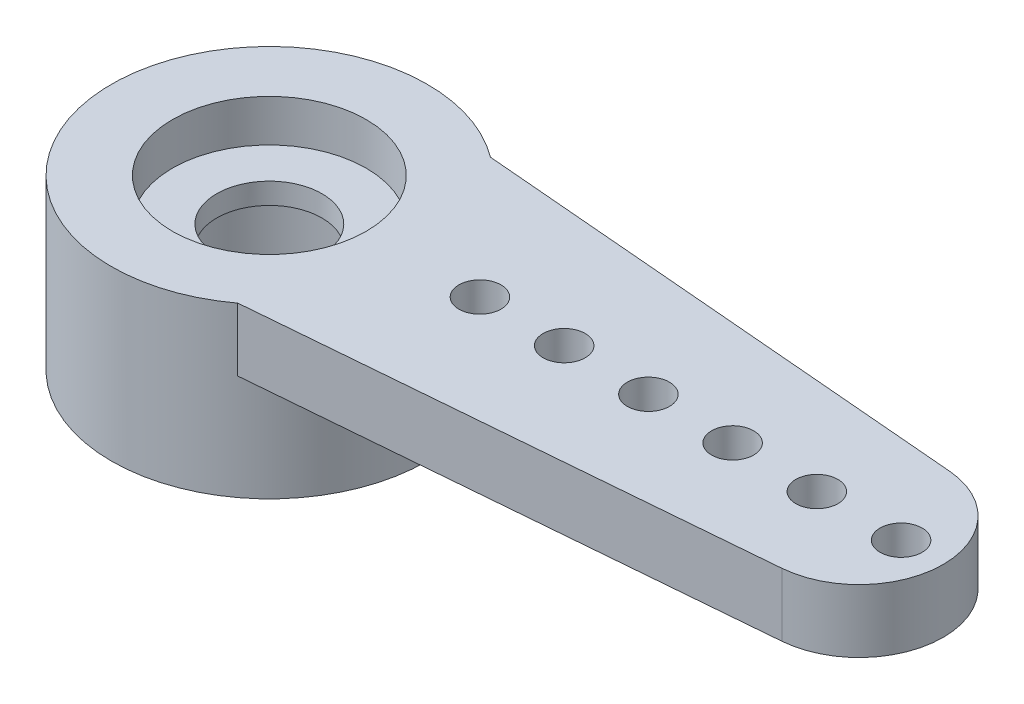
ISO-10303-21;
HEADER;
FILE_DESCRIPTION(('STEP AP214'),'2;1');
FILE_NAME('part.step','',(''),(''),'','','');
FILE_SCHEMA(('AUTOMOTIVE_DESIGN { 1 0 10303 214 1 1 1 1 }'));
ENDSEC;
DATA;
#1=APPLICATION_CONTEXT('core data for automotive mechanical design processes');
#2=APPLICATION_PROTOCOL_DEFINITION('international standard','automotive_design',2000,#1);
#3=PRODUCT_CONTEXT('',#1,'mechanical');
#4=PRODUCT('Part','Part','',(#3));
#5=PRODUCT_RELATED_PRODUCT_CATEGORY('part','',(#4));
#6=PRODUCT_DEFINITION_FORMATION('','',#4);
#7=PRODUCT_DEFINITION_CONTEXT('part definition',#1,'design');
#8=PRODUCT_DEFINITION('design','',#6,#7);
#9=PRODUCT_DEFINITION_SHAPE('','',#8);
#10=(LENGTH_UNIT() NAMED_UNIT(*) SI_UNIT(.MILLI.,.METRE.));
#11=(NAMED_UNIT(*) PLANE_ANGLE_UNIT() SI_UNIT($,.RADIAN.));
#12=(NAMED_UNIT(*) SI_UNIT($,.STERADIAN.) SOLID_ANGLE_UNIT());
#13=UNCERTAINTY_MEASURE_WITH_UNIT(LENGTH_MEASURE(1.E-05),#10,'distance_accuracy_value','');
#14=(GEOMETRIC_REPRESENTATION_CONTEXT(3) GLOBAL_UNCERTAINTY_ASSIGNED_CONTEXT((#13)) GLOBAL_UNIT_ASSIGNED_CONTEXT((#10,
#11,#12)) REPRESENTATION_CONTEXT('',''));
#15=CARTESIAN_POINT('',(0.,0.,0.));
#16=DIRECTION('',(0.,0.,1.));
#17=DIRECTION('',(1.,0.,0.));
#18=AXIS2_PLACEMENT_3D('',#15,#16,#17);
#19=CARTESIAN_POINT('',(0.,-1.5,0.));
#20=DIRECTION('',(0.,1.,0.));
#21=DIRECTION('',(0.,0.,1.));
#22=AXIS2_PLACEMENT_3D('',#19,#20,#21);
#23=CYLINDRICAL_SURFACE('',#22,1.25);
#24=CARTESIAN_POINT('',(0.,3.,0.));
#25=DIRECTION('',(0.,1.,0.));
#26=DIRECTION('',(0.,0.,1.));
#27=AXIS2_PLACEMENT_3D('',#24,#25,#26);
#28=CIRCLE('',#27,1.25);
#29=CARTESIAN_POINT('',(0.,3.,1.25));
#30=VERTEX_POINT('',#29);
#31=EDGE_CURVE('E217',#30,#30,#28,.T.);
#32=ORIENTED_EDGE('',*,*,#31,.T.);
#33=EDGE_LOOP('',(#32));
#34=FACE_BOUND('',#33,.T.);
#35=CARTESIAN_POINT('',(0.,2.5,0.));
#36=DIRECTION('',(0.,-1.,0.));
#37=DIRECTION('',(0.,0.,-1.));
#38=AXIS2_PLACEMENT_3D('',#35,#36,#37);
#39=CIRCLE('',#38,1.25);
#40=CARTESIAN_POINT('',(0.,2.5,-1.25));
#41=VERTEX_POINT('',#40);
#42=EDGE_CURVE('E51',#41,#41,#39,.F.);
#43=ORIENTED_EDGE('',*,*,#42,.F.);
#44=EDGE_LOOP('',(#43));
#45=FACE_BOUND('',#44,.T.);
#46=ADVANCED_FACE('F50',(#34,#45),#23,.F.);
#47=CARTESIAN_POINT('',(0.,4.,0.));
#48=DIRECTION('',(0.,-1.,0.));
#49=DIRECTION('',(0.,0.,-1.));
#50=AXIS2_PLACEMENT_3D('',#47,#48,#49);
#51=CYLINDRICAL_SURFACE('',#50,3.75);
#52=CARTESIAN_POINT('',(0.,4.,0.));
#53=DIRECTION('',(0.,1.,0.));
#54=DIRECTION('',(0.,0.,1.));
#55=AXIS2_PLACEMENT_3D('',#52,#53,#54);
#56=CIRCLE('',#55,3.75);
#57=CARTESIAN_POINT('',(2.25,4.,-3.));
#58=VERTEX_POINT('',#57);
#59=CARTESIAN_POINT('',(2.25,4.,3.));
#60=VERTEX_POINT('',#59);
#61=EDGE_CURVE('E11',#58,#60,#56,.T.);
#62=ORIENTED_EDGE('',*,*,#61,.F.);
#63=DIRECTION('',(0.,1.,0.));
#64=VECTOR('',#63,1.);
#65=CARTESIAN_POINT('',(2.25,2.5,-3.));
#66=LINE('',#65,#64);
#67=CARTESIAN_POINT('',(2.25,2.5,-3.));
#68=VERTEX_POINT('',#67);
#69=EDGE_CURVE('E129',#68,#58,#66,.T.);
#70=ORIENTED_EDGE('',*,*,#69,.F.);
#71=CARTESIAN_POINT('',(0.,2.5,0.));
#72=DIRECTION('',(0.,-1.,0.));
#73=DIRECTION('',(0.,0.,-1.));
#74=AXIS2_PLACEMENT_3D('',#71,#72,#73);
#75=CIRCLE('',#74,3.75);
#76=CARTESIAN_POINT('',(2.25,2.5,3.));
#77=VERTEX_POINT('',#76);
#78=EDGE_CURVE('E71',#68,#77,#75,.T.);
#79=ORIENTED_EDGE('',*,*,#78,.T.);
#80=DIRECTION('',(0.,1.,0.));
#81=VECTOR('',#80,1.);
#82=CARTESIAN_POINT('',(2.25,2.5,3.));
#83=LINE('',#82,#81);
#84=EDGE_CURVE('E100',#77,#60,#83,.T.);
#85=ORIENTED_EDGE('',*,*,#84,.T.);
#86=EDGE_LOOP('',(#62,#70,#79,#85));
#87=FACE_BOUND('',#86,.T.);
#88=CARTESIAN_POINT('',(0.,0.,0.));
#89=DIRECTION('',(0.,1.,0.));
#90=DIRECTION('',(0.,0.,1.));
#91=AXIS2_PLACEMENT_3D('',#88,#89,#90);
#92=CIRCLE('',#91,3.75);
#93=CARTESIAN_POINT('',(0.,0.,3.75));
#94=VERTEX_POINT('',#93);
#95=EDGE_CURVE('E60',#94,#94,#92,.T.);
#96=ORIENTED_EDGE('',*,*,#95,.T.);
#97=EDGE_LOOP('',(#96));
#98=FACE_BOUND('',#97,.T.);
#99=ADVANCED_FACE('F47',(#87,#98),#51,.T.);
#100=CARTESIAN_POINT('',(0.,4.,0.));
#101=DIRECTION('',(0.,1.,0.));
#102=DIRECTION('',(0.,0.,1.));
#103=AXIS2_PLACEMENT_3D('',#100,#101,#102);
#104=PLANE('',#103);
#105=CARTESIAN_POINT('',(0.,4.,0.));
#106=DIRECTION('',(0.,1.,0.));
#107=DIRECTION('',(0.,0.,1.));
#108=AXIS2_PLACEMENT_3D('',#105,#106,#107);
#109=CIRCLE('',#108,2.3);
#110=CARTESIAN_POINT('',(0.,4.,2.3));
#111=VERTEX_POINT('',#110);
#112=EDGE_CURVE('E131',#111,#111,#109,.T.);
#113=ORIENTED_EDGE('',*,*,#112,.F.);
#114=EDGE_LOOP('',(#113));
#115=FACE_BOUND('',#114,.T.);
#116=ORIENTED_EDGE('',*,*,#61,.T.);
#117=DIRECTION('',(0.996448898518601,0.,-0.0841997187707063));
#118=VECTOR('',#117,1.);
#119=CARTESIAN_POINT('',(14.1683994375414,4.,1.9928977970372));
#120=LINE('',#119,#118);
#121=CARTESIAN_POINT('',(14.1683994375414,4.,1.99289779703721));
#122=VERTEX_POINT('',#121);
#123=EDGE_CURVE('E122',#60,#122,#120,.T.);
#124=ORIENTED_EDGE('',*,*,#123,.T.);
#125=CARTESIAN_POINT('',(14.,4.,0.));
#126=DIRECTION('',(0.,1.,0.));
#127=DIRECTION('',(0.,0.,-1.));
#128=AXIS2_PLACEMENT_3D('',#125,#126,#127);
#129=CIRCLE('',#128,2.);
#130=CARTESIAN_POINT('',(14.1683994375414,4.,-1.9928977970372));
#131=VERTEX_POINT('',#130);
#132=EDGE_CURVE('E103',#122,#131,#129,.T.);
#133=ORIENTED_EDGE('',*,*,#132,.T.);
#134=DIRECTION('',(-0.996448898518601,0.,-0.0841997187707069));
#135=VECTOR('',#134,1.);
#136=CARTESIAN_POINT('',(14.1683994375414,4.,-1.9928977970372));
#137=LINE('',#136,#135);
#138=EDGE_CURVE('E63',#131,#58,#137,.T.);
#139=ORIENTED_EDGE('',*,*,#138,.T.);
#140=EDGE_LOOP('',(#116,#124,#133,#139));
#141=FACE_BOUND('',#140,.T.);
#142=CARTESIAN_POINT('',(13.,4.,0.));
#143=DIRECTION('',(0.,1.,0.));
#144=DIRECTION('',(0.,0.,-1.));
#145=AXIS2_PLACEMENT_3D('',#142,#143,#144);
#146=CIRCLE('',#145,0.500000000000001);
#147=CARTESIAN_POINT('',(13.,4.,-0.499999999999997));
#148=VERTEX_POINT('',#147);
#149=EDGE_CURVE('E226',#148,#148,#146,.T.);
#150=ORIENTED_EDGE('',*,*,#149,.F.);
#151=EDGE_LOOP('',(#150));
#152=FACE_BOUND('',#151,.T.);
#153=CARTESIAN_POINT('',(11.,4.,0.));
#154=DIRECTION('',(0.,1.,0.));
#155=DIRECTION('',(0.,0.,-1.));
#156=AXIS2_PLACEMENT_3D('',#153,#154,#155);
#157=CIRCLE('',#156,0.500000000000001);
#158=CARTESIAN_POINT('',(11.,4.,-0.499999999999997));
#159=VERTEX_POINT('',#158);
#160=EDGE_CURVE('E232',#159,#159,#157,.T.);
#161=ORIENTED_EDGE('',*,*,#160,.F.);
#162=EDGE_LOOP('',(#161));
#163=FACE_BOUND('',#162,.T.);
#164=CARTESIAN_POINT('',(9.,4.,0.));
#165=DIRECTION('',(0.,1.,0.));
#166=DIRECTION('',(0.,0.,-1.));
#167=AXIS2_PLACEMENT_3D('',#164,#165,#166);
#168=CIRCLE('',#167,0.500000000000001);
#169=CARTESIAN_POINT('',(9.,4.,-0.499999999999997));
#170=VERTEX_POINT('',#169);
#171=EDGE_CURVE('E231',#170,#170,#168,.T.);
#172=ORIENTED_EDGE('',*,*,#171,.F.);
#173=EDGE_LOOP('',(#172));
#174=FACE_BOUND('',#173,.T.);
#175=CARTESIAN_POINT('',(7.,4.,0.));
#176=DIRECTION('',(0.,1.,0.));
#177=DIRECTION('',(0.,0.,-1.));
#178=AXIS2_PLACEMENT_3D('',#175,#176,#177);
#179=CIRCLE('',#178,0.500000000000001);
#180=CARTESIAN_POINT('',(7.,4.,-0.499999999999997));
#181=VERTEX_POINT('',#180);
#182=EDGE_CURVE('E239',#181,#181,#179,.T.);
#183=ORIENTED_EDGE('',*,*,#182,.F.);
#184=EDGE_LOOP('',(#183));
#185=FACE_BOUND('',#184,.T.);
#186=CARTESIAN_POINT('',(5.,4.,0.));
#187=DIRECTION('',(0.,1.,0.));
#188=DIRECTION('',(0.,0.,-1.));
#189=AXIS2_PLACEMENT_3D('',#186,#187,#188);
#190=CIRCLE('',#189,0.500000000000001);
#191=CARTESIAN_POINT('',(5.,4.,-0.499999999999997));
#192=VERTEX_POINT('',#191);
#193=EDGE_CURVE('E245',#192,#192,#190,.T.);
#194=ORIENTED_EDGE('',*,*,#193,.F.);
#195=EDGE_LOOP('',(#194));
#196=FACE_BOUND('',#195,.T.);
#197=CARTESIAN_POINT('',(15.,4.,0.));
#198=DIRECTION('',(0.,1.,0.));
#199=DIRECTION('',(0.,0.,-1.));
#200=AXIS2_PLACEMENT_3D('',#197,#198,#199);
#201=CIRCLE('',#200,0.500000000000001);
#202=CARTESIAN_POINT('',(15.,4.,-0.499999999999997));
#203=VERTEX_POINT('',#202);
#204=EDGE_CURVE('E247',#203,#203,#201,.T.);
#205=ORIENTED_EDGE('',*,*,#204,.F.);
#206=EDGE_LOOP('',(#205));
#207=FACE_BOUND('',#206,.T.);
#208=ADVANCED_FACE('F151',(#115,#141,#152,#163,#174,#185,#196,#207),#104,.T.);
#209=CARTESIAN_POINT('',(0.,0.,0.));
#210=DIRECTION('',(0.,1.,0.));
#211=DIRECTION('',(0.,0.,1.));
#212=AXIS2_PLACEMENT_3D('',#209,#210,#211);
#213=PLANE('',#212);
#214=CARTESIAN_POINT('',(0.,0.,0.));
#215=DIRECTION('',(0.,-1.,0.));
#216=DIRECTION('',(0.,0.,-1.));
#217=AXIS2_PLACEMENT_3D('',#214,#215,#216);
#218=CIRCLE('',#217,2.3);
#219=CARTESIAN_POINT('',(0.,0.,-2.3));
#220=VERTEX_POINT('',#219);
#221=EDGE_CURVE('E282',#220,#220,#218,.T.);
#222=ORIENTED_EDGE('',*,*,#221,.F.);
#223=EDGE_LOOP('',(#222));
#224=FACE_BOUND('',#223,.T.);
#225=ORIENTED_EDGE('',*,*,#95,.F.);
#226=EDGE_LOOP('',(#225));
#227=FACE_BOUND('',#226,.T.);
#228=ADVANCED_FACE('F146',(#224,#227),#213,.F.);
#229=CARTESIAN_POINT('',(0.,3.,0.));
#230=DIRECTION('',(0.,1.,0.));
#231=DIRECTION('',(0.,0.,1.));
#232=AXIS2_PLACEMENT_3D('',#229,#230,#231);
#233=CYLINDRICAL_SURFACE('',#232,2.3);
#234=CARTESIAN_POINT('',(0.,3.,0.));
#235=DIRECTION('',(0.,1.,0.));
#236=DIRECTION('',(0.,0.,1.));
#237=AXIS2_PLACEMENT_3D('',#234,#235,#236);
#238=CIRCLE('',#237,2.3);
#239=CARTESIAN_POINT('',(0.,3.,2.3));
#240=VERTEX_POINT('',#239);
#241=EDGE_CURVE('E140',#240,#240,#238,.T.);
#242=ORIENTED_EDGE('',*,*,#241,.F.);
#243=EDGE_LOOP('',(#242));
#244=FACE_BOUND('',#243,.T.);
#245=ORIENTED_EDGE('',*,*,#112,.T.);
#246=EDGE_LOOP('',(#245));
#247=FACE_BOUND('',#246,.T.);
#248=ADVANCED_FACE('F147',(#244,#247),#233,.F.);
#249=CARTESIAN_POINT('',(0.,3.,0.));
#250=DIRECTION('',(0.,1.,0.));
#251=DIRECTION('',(0.,0.,1.));
#252=AXIS2_PLACEMENT_3D('',#249,#250,#251);
#253=PLANE('',#252);
#254=ORIENTED_EDGE('',*,*,#31,.F.);
#255=EDGE_LOOP('',(#254));
#256=FACE_BOUND('',#255,.T.);
#257=ORIENTED_EDGE('',*,*,#241,.T.);
#258=EDGE_LOOP('',(#257));
#259=FACE_BOUND('',#258,.T.);
#260=ADVANCED_FACE('F160',(#256,#259),#253,.T.);
#261=CARTESIAN_POINT('',(14.1683994375414,2.5,-1.9928977970372));
#262=DIRECTION('',(0.0841997187707069,0.,-0.996448898518601));
#263=DIRECTION('',(-0.996448898518601,0.,-0.0841997187707069));
#264=AXIS2_PLACEMENT_3D('',#261,#262,#263);
#265=PLANE('',#264);
#266=ORIENTED_EDGE('',*,*,#138,.F.);
#267=DIRECTION('',(0.,1.,0.));
#268=VECTOR('',#267,1.);
#269=CARTESIAN_POINT('',(14.1683994375414,2.5,-1.9928977970372));
#270=LINE('',#269,#268);
#271=CARTESIAN_POINT('',(14.1683994375414,2.5,-1.9928977970372));
#272=VERTEX_POINT('',#271);
#273=EDGE_CURVE('E93',#272,#131,#270,.T.);
#274=ORIENTED_EDGE('',*,*,#273,.F.);
#275=DIRECTION('',(-0.996448898518601,0.,-0.0841997187707069));
#276=VECTOR('',#275,1.);
#277=CARTESIAN_POINT('',(14.1683994375414,2.5,-1.9928977970372));
#278=LINE('',#277,#276);
#279=EDGE_CURVE('E108',#272,#68,#278,.T.);
#280=ORIENTED_EDGE('',*,*,#279,.T.);
#281=ORIENTED_EDGE('',*,*,#69,.T.);
#282=EDGE_LOOP('',(#266,#274,#280,#281));
#283=FACE_BOUND('',#282,.T.);
#284=ADVANCED_FACE('F204',(#283),#265,.T.);
#285=CARTESIAN_POINT('',(14.,2.5,0.));
#286=DIRECTION('',(0.,1.,0.));
#287=DIRECTION('',(0.,0.,1.));
#288=AXIS2_PLACEMENT_3D('',#285,#286,#287);
#289=CYLINDRICAL_SURFACE('',#288,2.);
#290=ORIENTED_EDGE('',*,*,#132,.F.);
#291=DIRECTION('',(0.,1.,0.));
#292=VECTOR('',#291,1.);
#293=CARTESIAN_POINT('',(14.1683994375414,2.5,1.99289779703721));
#294=LINE('',#293,#292);
#295=CARTESIAN_POINT('',(14.1683994375414,2.5,1.99289779703721));
#296=VERTEX_POINT('',#295);
#297=EDGE_CURVE('E97',#296,#122,#294,.T.);
#298=ORIENTED_EDGE('',*,*,#297,.F.);
#299=CARTESIAN_POINT('',(14.,2.5,0.));
#300=DIRECTION('',(0.,1.,0.));
#301=DIRECTION('',(0.,0.,-1.));
#302=AXIS2_PLACEMENT_3D('',#299,#300,#301);
#303=CIRCLE('',#302,2.);
#304=EDGE_CURVE('E105',#296,#272,#303,.T.);
#305=ORIENTED_EDGE('',*,*,#304,.T.);
#306=ORIENTED_EDGE('',*,*,#273,.T.);
#307=EDGE_LOOP('',(#290,#298,#305,#306));
#308=FACE_BOUND('',#307,.T.);
#309=ADVANCED_FACE('F101',(#308),#289,.T.);
#310=CARTESIAN_POINT('',(14.1683994375414,2.5,1.9928977970372));
#311=DIRECTION('',(0.0841997187707063,0.,0.996448898518601));
#312=DIRECTION('',(0.996448898518601,0.,-0.0841997187707063));
#313=AXIS2_PLACEMENT_3D('',#310,#311,#312);
#314=PLANE('',#313);
#315=ORIENTED_EDGE('',*,*,#123,.F.);
#316=ORIENTED_EDGE('',*,*,#84,.F.);
#317=DIRECTION('',(0.996448898518601,0.,-0.0841997187707063));
#318=VECTOR('',#317,1.);
#319=CARTESIAN_POINT('',(14.1683994375414,2.5,1.9928977970372));
#320=LINE('',#319,#318);
#321=EDGE_CURVE('E107',#77,#296,#320,.T.);
#322=ORIENTED_EDGE('',*,*,#321,.T.);
#323=ORIENTED_EDGE('',*,*,#297,.T.);
#324=EDGE_LOOP('',(#315,#316,#322,#323));
#325=FACE_BOUND('',#324,.T.);
#326=ADVANCED_FACE('F115',(#325),#314,.T.);
#327=CARTESIAN_POINT('',(0.,2.5,0.));
#328=DIRECTION('',(0.,-1.,0.));
#329=DIRECTION('',(0.,0.,-1.));
#330=AXIS2_PLACEMENT_3D('',#327,#328,#329);
#331=PLANE('',#330);
#332=CARTESIAN_POINT('',(13.,2.5,0.));
#333=DIRECTION('',(0.,1.,0.));
#334=DIRECTION('',(0.,0.,-1.));
#335=AXIS2_PLACEMENT_3D('',#332,#333,#334);
#336=CIRCLE('',#335,0.500000000000001);
#337=CARTESIAN_POINT('',(13.,2.5,-0.499999999999997));
#338=VERTEX_POINT('',#337);
#339=EDGE_CURVE('E273',#338,#338,#336,.T.);
#340=ORIENTED_EDGE('',*,*,#339,.T.);
#341=EDGE_LOOP('',(#340));
#342=FACE_BOUND('',#341,.T.);
#343=CARTESIAN_POINT('',(11.,2.5,0.));
#344=DIRECTION('',(0.,1.,0.));
#345=DIRECTION('',(0.,0.,-1.));
#346=AXIS2_PLACEMENT_3D('',#343,#344,#345);
#347=CIRCLE('',#346,0.500000000000001);
#348=CARTESIAN_POINT('',(11.,2.5,-0.499999999999997));
#349=VERTEX_POINT('',#348);
#350=EDGE_CURVE('E268',#349,#349,#347,.T.);
#351=ORIENTED_EDGE('',*,*,#350,.T.);
#352=EDGE_LOOP('',(#351));
#353=FACE_BOUND('',#352,.T.);
#354=CARTESIAN_POINT('',(9.,2.5,0.));
#355=DIRECTION('',(0.,1.,0.));
#356=DIRECTION('',(0.,0.,-1.));
#357=AXIS2_PLACEMENT_3D('',#354,#355,#356);
#358=CIRCLE('',#357,0.500000000000001);
#359=CARTESIAN_POINT('',(9.,2.5,-0.499999999999997));
#360=VERTEX_POINT('',#359);
#361=EDGE_CURVE('E265',#360,#360,#358,.T.);
#362=ORIENTED_EDGE('',*,*,#361,.T.);
#363=EDGE_LOOP('',(#362));
#364=FACE_BOUND('',#363,.T.);
#365=CARTESIAN_POINT('',(7.,2.5,0.));
#366=DIRECTION('',(0.,1.,0.));
#367=DIRECTION('',(0.,0.,-1.));
#368=AXIS2_PLACEMENT_3D('',#365,#366,#367);
#369=CIRCLE('',#368,0.500000000000001);
#370=CARTESIAN_POINT('',(7.,2.5,-0.499999999999997));
#371=VERTEX_POINT('',#370);
#372=EDGE_CURVE('E256',#371,#371,#369,.T.);
#373=ORIENTED_EDGE('',*,*,#372,.T.);
#374=EDGE_LOOP('',(#373));
#375=FACE_BOUND('',#374,.T.);
#376=CARTESIAN_POINT('',(5.,2.5,0.));
#377=DIRECTION('',(0.,1.,0.));
#378=DIRECTION('',(0.,0.,-1.));
#379=AXIS2_PLACEMENT_3D('',#376,#377,#378);
#380=CIRCLE('',#379,0.500000000000001);
#381=CARTESIAN_POINT('',(5.,2.5,-0.499999999999997));
#382=VERTEX_POINT('',#381);
#383=EDGE_CURVE('E249',#382,#382,#380,.T.);
#384=ORIENTED_EDGE('',*,*,#383,.T.);
#385=EDGE_LOOP('',(#384));
#386=FACE_BOUND('',#385,.T.);
#387=CARTESIAN_POINT('',(15.,2.5,0.));
#388=DIRECTION('',(0.,1.,0.));
#389=DIRECTION('',(0.,0.,-1.));
#390=AXIS2_PLACEMENT_3D('',#387,#388,#389);
#391=CIRCLE('',#390,0.500000000000001);
#392=CARTESIAN_POINT('',(15.,2.5,-0.499999999999997));
#393=VERTEX_POINT('',#392);
#394=EDGE_CURVE('E124',#393,#393,#391,.T.);
#395=ORIENTED_EDGE('',*,*,#394,.T.);
#396=EDGE_LOOP('',(#395));
#397=FACE_BOUND('',#396,.T.);
#398=ORIENTED_EDGE('',*,*,#78,.F.);
#399=ORIENTED_EDGE('',*,*,#279,.F.);
#400=ORIENTED_EDGE('',*,*,#304,.F.);
#401=ORIENTED_EDGE('',*,*,#321,.F.);
#402=EDGE_LOOP('',(#398,#399,#400,#401));
#403=FACE_BOUND('',#402,.T.);
#404=ADVANCED_FACE('F110',(#342,#353,#364,#375,#386,#397,#403),#331,.T.);
#405=CARTESIAN_POINT('',(15.,2.5,0.));
#406=DIRECTION('',(0.,1.,0.));
#407=DIRECTION('',(0.,0.,1.));
#408=AXIS2_PLACEMENT_3D('',#405,#406,#407);
#409=CYLINDRICAL_SURFACE('',#408,0.500000000000001);
#410=ORIENTED_EDGE('',*,*,#394,.F.);
#411=EDGE_LOOP('',(#410));
#412=FACE_BOUND('',#411,.T.);
#413=ORIENTED_EDGE('',*,*,#204,.T.);
#414=EDGE_LOOP('',(#413));
#415=FACE_BOUND('',#414,.T.);
#416=ADVANCED_FACE('F198',(#412,#415),#409,.F.);
#417=CARTESIAN_POINT('',(5.,2.5,0.));
#418=DIRECTION('',(0.,1.,0.));
#419=DIRECTION('',(0.,0.,1.));
#420=AXIS2_PLACEMENT_3D('',#417,#418,#419);
#421=CYLINDRICAL_SURFACE('',#420,0.500000000000001);
#422=ORIENTED_EDGE('',*,*,#383,.F.);
#423=EDGE_LOOP('',(#422));
#424=FACE_BOUND('',#423,.T.);
#425=ORIENTED_EDGE('',*,*,#193,.T.);
#426=EDGE_LOOP('',(#425));
#427=FACE_BOUND('',#426,.T.);
#428=ADVANCED_FACE('F195',(#424,#427),#421,.F.);
#429=CARTESIAN_POINT('',(7.,2.5,0.));
#430=DIRECTION('',(0.,1.,0.));
#431=DIRECTION('',(0.,0.,1.));
#432=AXIS2_PLACEMENT_3D('',#429,#430,#431);
#433=CYLINDRICAL_SURFACE('',#432,0.500000000000001);
#434=ORIENTED_EDGE('',*,*,#372,.F.);
#435=EDGE_LOOP('',(#434));
#436=FACE_BOUND('',#435,.T.);
#437=ORIENTED_EDGE('',*,*,#182,.T.);
#438=EDGE_LOOP('',(#437));
#439=FACE_BOUND('',#438,.T.);
#440=ADVANCED_FACE('F190',(#436,#439),#433,.F.);
#441=CARTESIAN_POINT('',(9.,2.5,0.));
#442=DIRECTION('',(0.,1.,0.));
#443=DIRECTION('',(0.,0.,1.));
#444=AXIS2_PLACEMENT_3D('',#441,#442,#443);
#445=CYLINDRICAL_SURFACE('',#444,0.500000000000001);
#446=ORIENTED_EDGE('',*,*,#361,.F.);
#447=EDGE_LOOP('',(#446));
#448=FACE_BOUND('',#447,.T.);
#449=ORIENTED_EDGE('',*,*,#171,.T.);
#450=EDGE_LOOP('',(#449));
#451=FACE_BOUND('',#450,.T.);
#452=ADVANCED_FACE('F184',(#448,#451),#445,.F.);
#453=CARTESIAN_POINT('',(11.,2.5,0.));
#454=DIRECTION('',(0.,1.,0.));
#455=DIRECTION('',(0.,0.,1.));
#456=AXIS2_PLACEMENT_3D('',#453,#454,#455);
#457=CYLINDRICAL_SURFACE('',#456,0.500000000000001);
#458=ORIENTED_EDGE('',*,*,#350,.F.);
#459=EDGE_LOOP('',(#458));
#460=FACE_BOUND('',#459,.T.);
#461=ORIENTED_EDGE('',*,*,#160,.T.);
#462=EDGE_LOOP('',(#461));
#463=FACE_BOUND('',#462,.T.);
#464=ADVANCED_FACE('F176',(#460,#463),#457,.F.);
#465=CARTESIAN_POINT('',(13.,2.5,0.));
#466=DIRECTION('',(0.,1.,0.));
#467=DIRECTION('',(0.,0.,1.));
#468=AXIS2_PLACEMENT_3D('',#465,#466,#467);
#469=CYLINDRICAL_SURFACE('',#468,0.500000000000001);
#470=ORIENTED_EDGE('',*,*,#339,.F.);
#471=EDGE_LOOP('',(#470));
#472=FACE_BOUND('',#471,.T.);
#473=ORIENTED_EDGE('',*,*,#149,.T.);
#474=EDGE_LOOP('',(#473));
#475=FACE_BOUND('',#474,.T.);
#476=ADVANCED_FACE('F177',(#472,#475),#469,.F.);
#477=CARTESIAN_POINT('',(0.,2.5,0.));
#478=DIRECTION('',(0.,-1.,0.));
#479=DIRECTION('',(0.,0.,-1.));
#480=AXIS2_PLACEMENT_3D('',#477,#478,#479);
#481=PLANE('',#480);
#482=CARTESIAN_POINT('',(0.,2.5,0.));
#483=DIRECTION('',(0.,-1.,0.));
#484=DIRECTION('',(0.,0.,-1.));
#485=AXIS2_PLACEMENT_3D('',#482,#483,#484);
#486=CIRCLE('',#485,2.3);
#487=CARTESIAN_POINT('',(0.,2.5,-2.3));
#488=VERTEX_POINT('',#487);
#489=EDGE_CURVE('E289',#488,#488,#486,.T.);
#490=ORIENTED_EDGE('',*,*,#489,.T.);
#491=EDGE_LOOP('',(#490));
#492=FACE_BOUND('',#491,.T.);
#493=ORIENTED_EDGE('',*,*,#42,.T.);
#494=EDGE_LOOP('',(#493));
#495=FACE_BOUND('',#494,.T.);
#496=ADVANCED_FACE('F179',(#492,#495),#481,.T.);
#497=CARTESIAN_POINT('',(0.,2.5,0.));
#498=DIRECTION('',(0.,-1.,0.));
#499=DIRECTION('',(0.,0.,-1.));
#500=AXIS2_PLACEMENT_3D('',#497,#498,#499);
#501=CYLINDRICAL_SURFACE('',#500,2.3);
#502=ORIENTED_EDGE('',*,*,#489,.F.);
#503=EDGE_LOOP('',(#502));
#504=FACE_BOUND('',#503,.T.);
#505=ORIENTED_EDGE('',*,*,#221,.T.);
#506=EDGE_LOOP('',(#505));
#507=FACE_BOUND('',#506,.T.);
#508=ADVANCED_FACE('F173',(#504,#507),#501,.F.);
#509=CLOSED_SHELL('',(#46,#99,#208,#228,#248,#260,#284,#309,#326,#404,#416,#428,#440,#452,#464,
#476,#496,#508));
#510=MANIFOLD_SOLID_BREP('B2',#509);
#511=ADVANCED_BREP_SHAPE_REPRESENTATION('',(#18,#510),#14);
#512=SHAPE_DEFINITION_REPRESENTATION(#9,#511);
ENDSEC;
END-ISO-10303-21;
